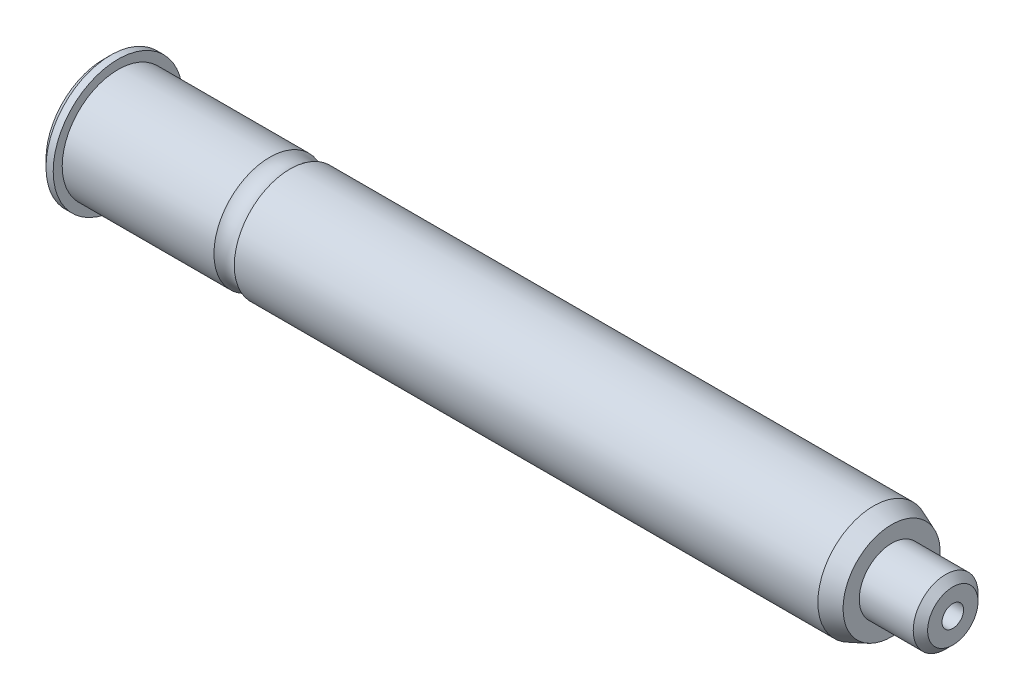
ISO-10303-21;
HEADER;
FILE_DESCRIPTION(('STEP AP214'),'2;1');
FILE_NAME('part.step','',(''),(''),'','','');
FILE_SCHEMA(('AUTOMOTIVE_DESIGN { 1 0 10303 214 1 1 1 1 }'));
ENDSEC;
DATA;
#1=APPLICATION_CONTEXT('core data for automotive mechanical design processes');
#2=APPLICATION_PROTOCOL_DEFINITION('international standard','automotive_design',2000,#1);
#3=PRODUCT_CONTEXT('',#1,'mechanical');
#4=PRODUCT('Part','Part','',(#3));
#5=PRODUCT_RELATED_PRODUCT_CATEGORY('part','',(#4));
#6=PRODUCT_DEFINITION_FORMATION('','',#4);
#7=PRODUCT_DEFINITION_CONTEXT('part definition',#1,'design');
#8=PRODUCT_DEFINITION('design','',#6,#7);
#9=PRODUCT_DEFINITION_SHAPE('','',#8);
#10=(LENGTH_UNIT() NAMED_UNIT(*) SI_UNIT(.MILLI.,.METRE.));
#11=(NAMED_UNIT(*) PLANE_ANGLE_UNIT() SI_UNIT($,.RADIAN.));
#12=(NAMED_UNIT(*) SI_UNIT($,.STERADIAN.) SOLID_ANGLE_UNIT());
#13=UNCERTAINTY_MEASURE_WITH_UNIT(LENGTH_MEASURE(1.E-05),#10,'distance_accuracy_value','');
#14=(GEOMETRIC_REPRESENTATION_CONTEXT(3) GLOBAL_UNCERTAINTY_ASSIGNED_CONTEXT((#13)) GLOBAL_UNIT_ASSIGNED_CONTEXT((#10,
#11,#12)) REPRESENTATION_CONTEXT('',''));
#15=CARTESIAN_POINT('',(0.,0.,0.));
#16=DIRECTION('',(0.,0.,1.));
#17=DIRECTION('',(1.,0.,0.));
#18=AXIS2_PLACEMENT_3D('',#15,#16,#17);
#19=CARTESIAN_POINT('',(0.,0.,0.));
#20=DIRECTION('',(-1.,0.,0.));
#21=DIRECTION('',(0.,0.,1.));
#22=AXIS2_PLACEMENT_3D('',#19,#20,#21);
#23=PLANE('',#22);
#24=CARTESIAN_POINT('',(0.,0.,0.));
#25=DIRECTION('',(-1.,0.,0.));
#26=DIRECTION('',(0.,0.,1.));
#27=AXIS2_PLACEMENT_3D('',#24,#25,#26);
#28=CIRCLE('',#27,7.99999999999998);
#29=CARTESIAN_POINT('',(0.,0.,7.99999999999998));
#30=VERTEX_POINT('',#29);
#31=EDGE_CURVE('E78',#30,#30,#28,.T.);
#32=ORIENTED_EDGE('',*,*,#31,.T.);
#33=EDGE_LOOP('',(#32));
#34=FACE_BOUND('',#33,.T.);
#35=ADVANCED_FACE('F33',(#34),#23,.T.);
#36=CARTESIAN_POINT('',(-10.,0.,0.));
#37=DIRECTION('',(-1.,0.,0.));
#38=DIRECTION('',(0.,0.,1.));
#39=AXIS2_PLACEMENT_3D('',#36,#37,#38);
#40=CYLINDRICAL_SURFACE('',#39,9.);
#41=CARTESIAN_POINT('',(1.00000000000001,0.,0.));
#42=DIRECTION('',(-1.,0.,0.));
#43=DIRECTION('',(0.,0.,1.));
#44=AXIS2_PLACEMENT_3D('',#41,#42,#43);
#45=CIRCLE('',#44,9.);
#46=CARTESIAN_POINT('',(1.00000000000001,0.,9.));
#47=VERTEX_POINT('',#46);
#48=EDGE_CURVE('E81',#47,#47,#45,.F.);
#49=ORIENTED_EDGE('',*,*,#48,.T.);
#50=EDGE_LOOP('',(#49));
#51=FACE_BOUND('',#50,.T.);
#52=CARTESIAN_POINT('',(2.,0.,0.));
#53=DIRECTION('',(-1.,0.,0.));
#54=DIRECTION('',(0.,0.,1.));
#55=AXIS2_PLACEMENT_3D('',#52,#53,#54);
#56=CIRCLE('',#55,9.);
#57=CARTESIAN_POINT('',(2.,0.,9.));
#58=VERTEX_POINT('',#57);
#59=EDGE_CURVE('E75',#58,#58,#56,.T.);
#60=ORIENTED_EDGE('',*,*,#59,.T.);
#61=EDGE_LOOP('',(#60));
#62=FACE_BOUND('',#61,.T.);
#63=ADVANCED_FACE('F101',(#51,#62),#40,.T.);
#64=CARTESIAN_POINT('',(2.,-9.,0.));
#65=DIRECTION('',(1.,0.,0.));
#66=DIRECTION('',(0.,0.,-1.));
#67=AXIS2_PLACEMENT_3D('',#64,#65,#66);
#68=PLANE('',#67);
#69=CARTESIAN_POINT('',(2.,0.,0.));
#70=DIRECTION('',(-1.,0.,0.));
#71=DIRECTION('',(0.,0.,1.));
#72=AXIS2_PLACEMENT_3D('',#69,#70,#71);
#73=CIRCLE('',#72,7.75);
#74=CARTESIAN_POINT('',(2.,0.,7.75));
#75=VERTEX_POINT('',#74);
#76=EDGE_CURVE('E72',#75,#75,#73,.T.);
#77=ORIENTED_EDGE('',*,*,#76,.T.);
#78=EDGE_LOOP('',(#77));
#79=FACE_BOUND('',#78,.T.);
#80=ORIENTED_EDGE('',*,*,#59,.F.);
#81=EDGE_LOOP('',(#80));
#82=FACE_BOUND('',#81,.T.);
#83=ADVANCED_FACE('F106',(#79,#82),#68,.T.);
#84=CARTESIAN_POINT('',(-10.,0.,0.));
#85=DIRECTION('',(-1.,0.,0.));
#86=DIRECTION('',(0.,0.,1.));
#87=AXIS2_PLACEMENT_3D('',#84,#85,#86);
#88=CYLINDRICAL_SURFACE('',#87,7.75);
#89=CARTESIAN_POINT('',(23.0857864376269,0.,0.));
#90=DIRECTION('',(-1.,0.,0.));
#91=DIRECTION('',(0.,0.,1.));
#92=AXIS2_PLACEMENT_3D('',#89,#90,#91);
#93=CIRCLE('',#92,7.75);
#94=CARTESIAN_POINT('',(23.0857864376269,0.,7.75));
#95=VERTEX_POINT('',#94);
#96=EDGE_CURVE('E69',#95,#95,#93,.T.);
#97=ORIENTED_EDGE('',*,*,#96,.T.);
#98=EDGE_LOOP('',(#97));
#99=FACE_BOUND('',#98,.T.);
#100=ORIENTED_EDGE('',*,*,#76,.F.);
#101=EDGE_LOOP('',(#100));
#102=FACE_BOUND('',#101,.T.);
#103=ADVANCED_FACE('F113',(#99,#102),#88,.T.);
#104=CARTESIAN_POINT('',(24.5,0.,0.));
#105=DIRECTION('',(-1.,0.,0.));
#106=DIRECTION('',(0.,0.,1.));
#107=AXIS2_PLACEMENT_3D('',#104,#105,#106);
#108=TOROIDAL_SURFACE('',#107,9.5,2.25);
#109=CARTESIAN_POINT('',(25.9142135623731,0.,0.));
#110=DIRECTION('',(-1.,0.,0.));
#111=DIRECTION('',(0.,0.,1.));
#112=AXIS2_PLACEMENT_3D('',#109,#110,#111);
#113=CIRCLE('',#112,7.75);
#114=CARTESIAN_POINT('',(25.9142135623731,0.,7.75));
#115=VERTEX_POINT('',#114);
#116=EDGE_CURVE('E66',#115,#115,#113,.T.);
#117=ORIENTED_EDGE('',*,*,#116,.T.);
#118=EDGE_LOOP('',(#117));
#119=FACE_BOUND('',#118,.T.);
#120=ORIENTED_EDGE('',*,*,#96,.F.);
#121=EDGE_LOOP('',(#120));
#122=FACE_BOUND('',#121,.T.);
#123=ADVANCED_FACE('F120',(#119,#122),#108,.F.);
#124=CARTESIAN_POINT('',(-10.,0.,0.));
#125=DIRECTION('',(-1.,0.,0.));
#126=DIRECTION('',(0.,0.,1.));
#127=AXIS2_PLACEMENT_3D('',#124,#125,#126);
#128=CYLINDRICAL_SURFACE('',#127,7.75);
#129=CARTESIAN_POINT('',(107.,0.,0.));
#130=DIRECTION('',(-1.,0.,0.));
#131=DIRECTION('',(0.,0.,1.));
#132=AXIS2_PLACEMENT_3D('',#129,#130,#131);
#133=CIRCLE('',#132,7.75);
#134=CARTESIAN_POINT('',(107.,0.,7.75));
#135=VERTEX_POINT('',#134);
#136=EDGE_CURVE('E63',#135,#135,#133,.T.);
#137=ORIENTED_EDGE('',*,*,#136,.T.);
#138=EDGE_LOOP('',(#137));
#139=FACE_BOUND('',#138,.T.);
#140=ORIENTED_EDGE('',*,*,#116,.F.);
#141=EDGE_LOOP('',(#140));
#142=FACE_BOUND('',#141,.T.);
#143=ADVANCED_FACE('F124',(#139,#142),#128,.T.);
#144=CARTESIAN_POINT('',(107.,0.,0.));
#145=DIRECTION('',(-1.,0.,0.));
#146=DIRECTION('',(0.,0.,1.));
#147=AXIS2_PLACEMENT_3D('',#144,#145,#146);
#148=CONICAL_SURFACE('',#147,7.75,0.380506377112365);
#149=CARTESIAN_POINT('',(109.5,0.,0.));
#150=DIRECTION('',(-1.,0.,0.));
#151=DIRECTION('',(0.,0.,1.));
#152=AXIS2_PLACEMENT_3D('',#149,#150,#151);
#153=CIRCLE('',#152,6.75);
#154=CARTESIAN_POINT('',(109.5,0.,6.75));
#155=VERTEX_POINT('',#154);
#156=EDGE_CURVE('E56',#155,#155,#153,.T.);
#157=ORIENTED_EDGE('',*,*,#156,.T.);
#158=EDGE_LOOP('',(#157));
#159=FACE_BOUND('',#158,.T.);
#160=ORIENTED_EDGE('',*,*,#136,.F.);
#161=EDGE_LOOP('',(#160));
#162=FACE_BOUND('',#161,.T.);
#163=ADVANCED_FACE('F128',(#159,#162),#148,.T.);
#164=CARTESIAN_POINT('',(109.5,-6.75,0.));
#165=DIRECTION('',(1.,0.,0.));
#166=DIRECTION('',(0.,0.,-1.));
#167=AXIS2_PLACEMENT_3D('',#164,#165,#166);
#168=PLANE('',#167);
#169=CARTESIAN_POINT('',(109.5,0.,0.));
#170=DIRECTION('',(-1.,0.,0.));
#171=DIRECTION('',(0.,0.,1.));
#172=AXIS2_PLACEMENT_3D('',#169,#170,#171);
#173=CIRCLE('',#172,4.5);
#174=CARTESIAN_POINT('',(109.5,0.,4.5));
#175=VERTEX_POINT('',#174);
#176=EDGE_CURVE('E52',#175,#175,#173,.T.);
#177=ORIENTED_EDGE('',*,*,#176,.T.);
#178=EDGE_LOOP('',(#177));
#179=FACE_BOUND('',#178,.T.);
#180=ORIENTED_EDGE('',*,*,#156,.F.);
#181=EDGE_LOOP('',(#180));
#182=FACE_BOUND('',#181,.T.);
#183=ADVANCED_FACE('F132',(#179,#182),#168,.T.);
#184=CARTESIAN_POINT('',(-10.,0.,0.));
#185=DIRECTION('',(-1.,0.,0.));
#186=DIRECTION('',(0.,0.,1.));
#187=AXIS2_PLACEMENT_3D('',#184,#185,#186);
#188=CYLINDRICAL_SURFACE('',#187,4.5);
#189=CARTESIAN_POINT('',(117.,0.,0.));
#190=DIRECTION('',(1.,0.,0.));
#191=DIRECTION('',(0.,0.,-1.));
#192=AXIS2_PLACEMENT_3D('',#189,#190,#191);
#193=CIRCLE('',#192,4.5);
#194=CARTESIAN_POINT('',(117.,0.,-4.5));
#195=VERTEX_POINT('',#194);
#196=EDGE_CURVE('E39',#195,#195,#193,.F.);
#197=ORIENTED_EDGE('',*,*,#196,.T.);
#198=EDGE_LOOP('',(#197));
#199=FACE_BOUND('',#198,.T.);
#200=ORIENTED_EDGE('',*,*,#176,.F.);
#201=EDGE_LOOP('',(#200));
#202=FACE_BOUND('',#201,.T.);
#203=ADVANCED_FACE('F86',(#199,#202),#188,.T.);
#204=CARTESIAN_POINT('',(118.,-4.49999999999999,0.));
#205=DIRECTION('',(1.,0.,0.));
#206=DIRECTION('',(0.,0.,-1.));
#207=AXIS2_PLACEMENT_3D('',#204,#205,#206);
#208=PLANE('',#207);
#209=CARTESIAN_POINT('',(118.,0.,0.));
#210=DIRECTION('',(1.,0.,0.));
#211=DIRECTION('',(0.,0.,-1.));
#212=AXIS2_PLACEMENT_3D('',#209,#210,#211);
#213=CIRCLE('',#212,1.5);
#214=CARTESIAN_POINT('',(118.,0.,-1.5));
#215=VERTEX_POINT('',#214);
#216=EDGE_CURVE('E53',#215,#215,#213,.T.);
#217=ORIENTED_EDGE('',*,*,#216,.F.);
#218=EDGE_LOOP('',(#217));
#219=FACE_BOUND('',#218,.T.);
#220=CARTESIAN_POINT('',(118.,0.,0.));
#221=DIRECTION('',(1.,0.,0.));
#222=DIRECTION('',(0.,0.,-1.));
#223=AXIS2_PLACEMENT_3D('',#220,#221,#222);
#224=CIRCLE('',#223,3.49999999999999);
#225=CARTESIAN_POINT('',(118.,0.,-3.49999999999999));
#226=VERTEX_POINT('',#225);
#227=EDGE_CURVE('E11',#226,#226,#224,.T.);
#228=ORIENTED_EDGE('',*,*,#227,.T.);
#229=EDGE_LOOP('',(#228));
#230=FACE_BOUND('',#229,.T.);
#231=ADVANCED_FACE('F96',(#219,#230),#208,.T.);
#232=CARTESIAN_POINT('',(0.,0.,0.));
#233=DIRECTION('',(1.,0.,0.));
#234=DIRECTION('',(0.,0.,-1.));
#235=AXIS2_PLACEMENT_3D('',#232,#233,#234);
#236=CONICAL_SURFACE('',#235,7.99999999999998,0.785398163397453);
#237=ORIENTED_EDGE('',*,*,#48,.F.);
#238=EDGE_LOOP('',(#237));
#239=FACE_BOUND('',#238,.T.);
#240=ORIENTED_EDGE('',*,*,#31,.F.);
#241=EDGE_LOOP('',(#240));
#242=FACE_BOUND('',#241,.T.);
#243=ADVANCED_FACE('F90',(#239,#242),#236,.T.);
#244=CARTESIAN_POINT('',(117.,0.,0.));
#245=DIRECTION('',(-1.,0.,0.));
#246=DIRECTION('',(0.,0.,1.));
#247=AXIS2_PLACEMENT_3D('',#244,#245,#246);
#248=CONICAL_SURFACE('',#247,4.5,0.785398163397451);
#249=ORIENTED_EDGE('',*,*,#227,.F.);
#250=EDGE_LOOP('',(#249));
#251=FACE_BOUND('',#250,.T.);
#252=ORIENTED_EDGE('',*,*,#196,.F.);
#253=EDGE_LOOP('',(#252));
#254=FACE_BOUND('',#253,.T.);
#255=ADVANCED_FACE('F46',(#251,#254),#248,.T.);
#256=CARTESIAN_POINT('',(93.,0.,0.));
#257=DIRECTION('',(1.,0.,0.));
#258=DIRECTION('',(0.,0.,-1.));
#259=AXIS2_PLACEMENT_3D('',#256,#257,#258);
#260=CONICAL_SURFACE('',#259,1.5,1.02974425867666);
#261=CARTESIAN_POINT('',(92.0987090714587,0.,0.));
#262=VERTEX_POINT('',#261);
#263=VERTEX_LOOP('',#262);
#264=FACE_BOUND('',#263,.T.);
#265=CARTESIAN_POINT('',(93.,0.,0.));
#266=DIRECTION('',(1.,0.,0.));
#267=DIRECTION('',(0.,0.,-1.));
#268=AXIS2_PLACEMENT_3D('',#265,#266,#267);
#269=CIRCLE('',#268,1.5);
#270=CARTESIAN_POINT('',(93.,0.,-1.5));
#271=VERTEX_POINT('',#270);
#272=EDGE_CURVE('E50',#271,#271,#269,.T.);
#273=ORIENTED_EDGE('',*,*,#272,.T.);
#274=EDGE_LOOP('',(#273));
#275=FACE_BOUND('',#274,.T.);
#276=ADVANCED_FACE('F42',(#264,#275),#260,.F.);
#277=CARTESIAN_POINT('',(118.,0.,0.));
#278=DIRECTION('',(1.,0.,0.));
#279=DIRECTION('',(0.,0.,-1.));
#280=AXIS2_PLACEMENT_3D('',#277,#278,#279);
#281=CYLINDRICAL_SURFACE('',#280,1.5);
#282=ORIENTED_EDGE('',*,*,#272,.F.);
#283=EDGE_LOOP('',(#282));
#284=FACE_BOUND('',#283,.T.);
#285=ORIENTED_EDGE('',*,*,#216,.T.);
#286=EDGE_LOOP('',(#285));
#287=FACE_BOUND('',#286,.T.);
#288=ADVANCED_FACE('F45',(#284,#287),#281,.F.);
#289=CLOSED_SHELL('',(#35,#63,#83,#103,#123,#143,#163,#183,#203,#231,#243,#255,#276,#288));
#290=MANIFOLD_SOLID_BREP('B2',#289);
#291=ADVANCED_BREP_SHAPE_REPRESENTATION('',(#18,#290),#14);
#292=SHAPE_DEFINITION_REPRESENTATION(#9,#291);
ENDSEC;
END-ISO-10303-21;
